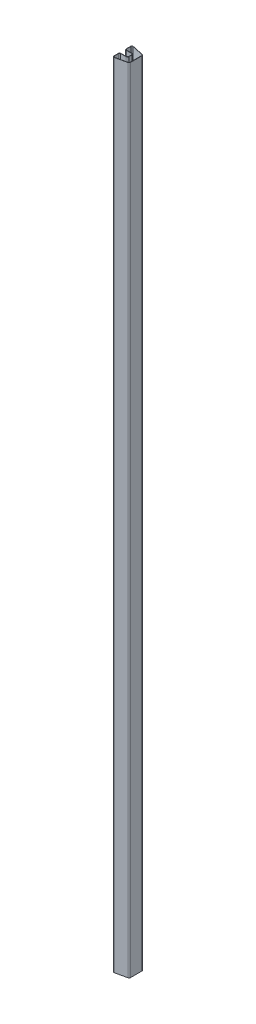
ISO-10303-21;
HEADER;
FILE_DESCRIPTION(('STEP AP214'),'2;1');
FILE_NAME('part.step','',(''),(''),'','','');
FILE_SCHEMA(('AUTOMOTIVE_DESIGN { 1 0 10303 214 1 1 1 1 }'));
ENDSEC;
DATA;
#1=APPLICATION_CONTEXT('core data for automotive mechanical design processes');
#2=APPLICATION_PROTOCOL_DEFINITION('international standard','automotive_design',2000,#1);
#3=PRODUCT_CONTEXT('',#1,'mechanical');
#4=PRODUCT('Part','Part','',(#3));
#5=PRODUCT_RELATED_PRODUCT_CATEGORY('part','',(#4));
#6=PRODUCT_DEFINITION_FORMATION('','',#4);
#7=PRODUCT_DEFINITION_CONTEXT('part definition',#1,'design');
#8=PRODUCT_DEFINITION('design','',#6,#7);
#9=PRODUCT_DEFINITION_SHAPE('','',#8);
#10=(LENGTH_UNIT() NAMED_UNIT(*) SI_UNIT(.MILLI.,.METRE.));
#11=(NAMED_UNIT(*) PLANE_ANGLE_UNIT() SI_UNIT($,.RADIAN.));
#12=(NAMED_UNIT(*) SI_UNIT($,.STERADIAN.) SOLID_ANGLE_UNIT());
#13=UNCERTAINTY_MEASURE_WITH_UNIT(LENGTH_MEASURE(1.E-05),#10,'distance_accuracy_value','');
#14=(GEOMETRIC_REPRESENTATION_CONTEXT(3) GLOBAL_UNCERTAINTY_ASSIGNED_CONTEXT((#13)) GLOBAL_UNIT_ASSIGNED_CONTEXT((#10,
#11,#12)) REPRESENTATION_CONTEXT('',''));
#15=CARTESIAN_POINT('',(0.,0.,0.));
#16=DIRECTION('',(0.,0.,1.));
#17=DIRECTION('',(1.,0.,0.));
#18=AXIS2_PLACEMENT_3D('',#15,#16,#17);
#19=CARTESIAN_POINT('',(0.,0.,0.));
#20=DIRECTION('',(0.,-1.,0.));
#21=DIRECTION('',(0.,0.,-1.));
#22=AXIS2_PLACEMENT_3D('',#19,#20,#21);
#23=PLANE('',#22);
#24=DIRECTION('',(0.976296007119934,0.,-0.216439613938102));
#25=VECTOR('',#24,1.);
#26=CARTESIAN_POINT('',(51.9976609563172,0.,46.0446230897532));
#27=LINE('',#26,#25);
#28=CARTESIAN_POINT('',(53.2141005702553,0.,45.7749449199157));
#29=VERTEX_POINT('',#28);
#30=CARTESIAN_POINT('',(61.7141005702553,0.,43.8905402874507));
#31=VERTEX_POINT('',#30);
#32=EDGE_CURVE('E348',#29,#31,#27,.T.);
#33=ORIENTED_EDGE('',*,*,#32,.F.);
#34=CARTESIAN_POINT('',(52.9976609563172,0.,44.7986489127958));
#35=DIRECTION('',(0.,-1.,0.));
#36=DIRECTION('',(0.,0.,-1.));
#37=AXIS2_PLACEMENT_3D('',#34,#35,#36);
#38=CIRCLE('',#37,1.);
#39=CARTESIAN_POINT('',(51.9976609563172,0.,44.7986489127958));
#40=VERTEX_POINT('',#39);
#41=EDGE_CURVE('E416',#29,#40,#38,.T.);
#42=ORIENTED_EDGE('',*,*,#41,.T.);
#43=DIRECTION('',(0.,0.,1.));
#44=VECTOR('',#43,1.);
#45=CARTESIAN_POINT('',(51.9976609563172,0.,40.5446230897532));
#46=LINE('',#45,#44);
#47=CARTESIAN_POINT('',(51.9976609563172,0.,41.5446230897532));
#48=VERTEX_POINT('',#47);
#49=EDGE_CURVE('E387',#48,#40,#46,.T.);
#50=ORIENTED_EDGE('',*,*,#49,.F.);
#51=CARTESIAN_POINT('',(52.9976609563172,0.,41.5446230897532));
#52=DIRECTION('',(0.,-1.,0.));
#53=DIRECTION('',(0.,0.,-1.));
#54=AXIS2_PLACEMENT_3D('',#51,#52,#53);
#55=CIRCLE('',#54,1.);
#56=CARTESIAN_POINT('',(52.9976609563172,0.,40.5446230897532));
#57=VERTEX_POINT('',#56);
#58=EDGE_CURVE('E414',#48,#57,#55,.T.);
#59=ORIENTED_EDGE('',*,*,#58,.T.);
#60=DIRECTION('',(-1.,0.,0.));
#61=VECTOR('',#60,1.);
#62=CARTESIAN_POINT('',(57.9976609563172,0.,40.5446230897533));
#63=LINE('',#62,#61);
#64=CARTESIAN_POINT('',(56.9976609563172,0.,40.5446230897533));
#65=VERTEX_POINT('',#64);
#66=EDGE_CURVE('E384',#65,#57,#63,.T.);
#67=ORIENTED_EDGE('',*,*,#66,.F.);
#68=CARTESIAN_POINT('',(56.9976609563172,0.,39.5446230897532));
#69=DIRECTION('',(0.,-1.,0.));
#70=DIRECTION('',(0.,0.,-1.));
#71=AXIS2_PLACEMENT_3D('',#68,#69,#70);
#72=CIRCLE('',#71,1.);
#73=CARTESIAN_POINT('',(57.9976609563172,0.,39.5446230897533));
#74=VERTEX_POINT('',#73);
#75=EDGE_CURVE('E455',#65,#74,#72,.F.);
#76=ORIENTED_EDGE('',*,*,#75,.T.);
#77=DIRECTION('',(0.,0.,1.));
#78=VECTOR('',#77,1.);
#79=CARTESIAN_POINT('',(57.9976609563172,0.,36.5446230897533));
#80=LINE('',#79,#78);
#81=CARTESIAN_POINT('',(57.9976609563172,0.,37.5446230897533));
#82=VERTEX_POINT('',#81);
#83=EDGE_CURVE('E381',#82,#74,#80,.T.);
#84=ORIENTED_EDGE('',*,*,#83,.F.);
#85=CARTESIAN_POINT('',(56.9976609563172,0.,37.5446230897533));
#86=DIRECTION('',(0.,-1.,0.));
#87=DIRECTION('',(0.,0.,-1.));
#88=AXIS2_PLACEMENT_3D('',#85,#86,#87);
#89=CIRCLE('',#88,1.);
#90=CARTESIAN_POINT('',(56.9976609563172,0.,36.5446230897533));
#91=VERTEX_POINT('',#90);
#92=EDGE_CURVE('E43',#82,#91,#89,.F.);
#93=ORIENTED_EDGE('',*,*,#92,.T.);
#94=DIRECTION('',(1.,0.,0.));
#95=VECTOR('',#94,1.);
#96=CARTESIAN_POINT('',(51.9976609563172,0.,36.5446230897533));
#97=LINE('',#96,#95);
#98=CARTESIAN_POINT('',(52.9976609563172,0.,36.5446230897533));
#99=VERTEX_POINT('',#98);
#100=EDGE_CURVE('E378',#99,#91,#97,.T.);
#101=ORIENTED_EDGE('',*,*,#100,.F.);
#102=CARTESIAN_POINT('',(52.9976609563172,0.,35.5446230897533));
#103=DIRECTION('',(0.,-1.,0.));
#104=DIRECTION('',(0.,0.,-1.));
#105=AXIS2_PLACEMENT_3D('',#102,#103,#104);
#106=CIRCLE('',#105,1.);
#107=CARTESIAN_POINT('',(51.9976609563172,0.,35.5446230897533));
#108=VERTEX_POINT('',#107);
#109=EDGE_CURVE('E412',#99,#108,#106,.T.);
#110=ORIENTED_EDGE('',*,*,#109,.T.);
#111=DIRECTION('',(0.,0.,1.));
#112=VECTOR('',#111,1.);
#113=CARTESIAN_POINT('',(51.9976609563173,0.,31.0446230897533));
#114=LINE('',#113,#112);
#115=CARTESIAN_POINT('',(51.9976609563173,0.,32.2905972667107));
#116=VERTEX_POINT('',#115);
#117=EDGE_CURVE('E375',#116,#108,#114,.T.);
#118=ORIENTED_EDGE('',*,*,#117,.F.);
#119=CARTESIAN_POINT('',(52.9976609563173,0.,32.2905972667107));
#120=DIRECTION('',(0.,-1.,0.));
#121=DIRECTION('',(0.,0.,-1.));
#122=AXIS2_PLACEMENT_3D('',#119,#120,#121);
#123=CIRCLE('',#122,1.);
#124=CARTESIAN_POINT('',(53.2141005702554,0.,31.3143012595908));
#125=VERTEX_POINT('',#124);
#126=EDGE_CURVE('E410',#116,#125,#123,.T.);
#127=ORIENTED_EDGE('',*,*,#126,.T.);
#128=DIRECTION('',(-0.976296007119932,0.,-0.216439613938108));
#129=VECTOR('',#128,1.);
#130=CARTESIAN_POINT('',(62.4976609563173,0.,33.3724170475042));
#131=LINE('',#130,#129);
#132=CARTESIAN_POINT('',(61.7141005702554,0.,33.1987058920558));
#133=VERTEX_POINT('',#132);
#134=EDGE_CURVE('E372',#133,#125,#131,.T.);
#135=ORIENTED_EDGE('',*,*,#134,.F.);
#136=CARTESIAN_POINT('',(61.4976609563173,0.,34.1750018991758));
#137=DIRECTION('',(0.,-1.,0.));
#138=DIRECTION('',(0.,0.,-1.));
#139=AXIS2_PLACEMENT_3D('',#136,#137,#138);
#140=CIRCLE('',#139,1.);
#141=CARTESIAN_POINT('',(62.4976609563173,0.,34.1750018991758));
#142=VERTEX_POINT('',#141);
#143=EDGE_CURVE('E408',#133,#142,#140,.T.);
#144=ORIENTED_EDGE('',*,*,#143,.T.);
#145=DIRECTION('',(0.,0.,-1.));
#146=VECTOR('',#145,1.);
#147=CARTESIAN_POINT('',(62.4976609563172,0.,43.7168291320024));
#148=LINE('',#147,#146);
#149=CARTESIAN_POINT('',(62.4976609563172,0.,42.9142442803308));
#150=VERTEX_POINT('',#149);
#151=EDGE_CURVE('E328',#150,#142,#148,.T.);
#152=ORIENTED_EDGE('',*,*,#151,.F.);
#153=CARTESIAN_POINT('',(61.4976609563172,0.,42.9142442803308));
#154=DIRECTION('',(0.,-1.,0.));
#155=DIRECTION('',(0.,0.,-1.));
#156=AXIS2_PLACEMENT_3D('',#153,#154,#155);
#157=CIRCLE('',#156,1.);
#158=EDGE_CURVE('E406',#150,#31,#157,.T.);
#159=ORIENTED_EDGE('',*,*,#158,.T.);
#160=EDGE_LOOP('',(#33,#42,#50,#59,#67,#76,#84,#93,#101,#110,#118,#127,#135,#144,#152,#159));
#161=FACE_BOUND('',#160,.T.);
#162=CARTESIAN_POINT('',(52.9976609563172,0.,44.7986489127958));
#163=DIRECTION('',(0.,-1.,0.));
#164=DIRECTION('',(0.,0.,-1.));
#165=AXIS2_PLACEMENT_3D('',#162,#163,#164);
#166=CIRCLE('',#165,0.8);
#167=CARTESIAN_POINT('',(53.1708126474677,0.,45.5796857184917));
#168=VERTEX_POINT('',#167);
#169=CARTESIAN_POINT('',(52.1976609563172,0.,44.7986489127958));
#170=VERTEX_POINT('',#169);
#171=EDGE_CURVE('E269',#168,#170,#166,.T.);
#172=ORIENTED_EDGE('',*,*,#171,.F.);
#173=DIRECTION('',(0.976296007119934,0.,-0.216439613938102));
#174=VECTOR('',#173,1.);
#175=CARTESIAN_POINT('',(12.1222493255186,0.,54.6799331161285));
#176=LINE('',#175,#174);
#177=CARTESIAN_POINT('',(61.6708126474677,0.,43.6952810860267));
#178=VERTEX_POINT('',#177);
#179=EDGE_CURVE('E261',#168,#178,#176,.T.);
#180=ORIENTED_EDGE('',*,*,#179,.T.);
#181=CARTESIAN_POINT('',(61.4976609563172,0.,42.9142442803308));
#182=DIRECTION('',(0.,-1.,0.));
#183=DIRECTION('',(0.,0.,-1.));
#184=AXIS2_PLACEMENT_3D('',#181,#182,#183);
#185=CIRCLE('',#184,0.8);
#186=CARTESIAN_POINT('',(62.2976609563172,0.,42.9142442803308));
#187=VERTEX_POINT('',#186);
#188=EDGE_CURVE('E246',#187,#178,#185,.T.);
#189=ORIENTED_EDGE('',*,*,#188,.F.);
#190=DIRECTION('',(0.,0.,-1.));
#191=VECTOR('',#190,1.);
#192=CARTESIAN_POINT('',(62.2976609563175,0.,3.76095974015518E-13));
#193=LINE('',#192,#191);
#194=CARTESIAN_POINT('',(62.2976609563173,0.,34.1750018991758));
#195=VERTEX_POINT('',#194);
#196=EDGE_CURVE('E58',#187,#195,#193,.T.);
#197=ORIENTED_EDGE('',*,*,#196,.T.);
#198=CARTESIAN_POINT('',(61.4976609563173,0.,34.1750018991758));
#199=DIRECTION('',(0.,-1.,0.));
#200=DIRECTION('',(0.,0.,-1.));
#201=AXIS2_PLACEMENT_3D('',#198,#199,#200);
#202=CIRCLE('',#201,0.8);
#203=CARTESIAN_POINT('',(61.6708126474677,2.22044604925031E-13,33.3939650934798));
#204=VERTEX_POINT('',#203);
#205=EDGE_CURVE('E254',#204,#195,#202,.T.);
#206=ORIENTED_EDGE('',*,*,#205,.F.);
#207=DIRECTION('',(-0.976296007119932,0.,-0.216439613938108));
#208=VECTOR('',#207,1.);
#209=CARTESIAN_POINT('',(-4.16741228412333,0.,18.7979820282604));
#210=LINE('',#209,#208);
#211=CARTESIAN_POINT('',(53.1708126474677,0.,31.5095604610148));
#212=VERTEX_POINT('',#211);
#213=EDGE_CURVE('E305',#204,#212,#210,.T.);
#214=ORIENTED_EDGE('',*,*,#213,.T.);
#215=CARTESIAN_POINT('',(52.9976609563173,0.,32.2905972667107));
#216=DIRECTION('',(0.,-1.,0.));
#217=DIRECTION('',(0.,0.,-1.));
#218=AXIS2_PLACEMENT_3D('',#215,#216,#217);
#219=CIRCLE('',#218,0.8);
#220=CARTESIAN_POINT('',(52.1976609563173,0.,32.2905972667107));
#221=VERTEX_POINT('',#220);
#222=EDGE_CURVE('E302',#221,#212,#219,.T.);
#223=ORIENTED_EDGE('',*,*,#222,.F.);
#224=DIRECTION('',(0.,0.,1.));
#225=VECTOR('',#224,1.);
#226=CARTESIAN_POINT('',(52.1976609563173,0.,0.));
#227=LINE('',#226,#225);
#228=CARTESIAN_POINT('',(52.1976609563173,0.,35.5446230897533));
#229=VERTEX_POINT('',#228);
#230=EDGE_CURVE('E300',#221,#229,#227,.T.);
#231=ORIENTED_EDGE('',*,*,#230,.T.);
#232=CARTESIAN_POINT('',(52.9976609563172,0.,35.5446230897533));
#233=DIRECTION('',(0.,-1.,0.));
#234=DIRECTION('',(0.,0.,-1.));
#235=AXIS2_PLACEMENT_3D('',#232,#233,#234);
#236=CIRCLE('',#235,0.8);
#237=CARTESIAN_POINT('',(52.9976609563172,0.,36.3446230897533));
#238=VERTEX_POINT('',#237);
#239=EDGE_CURVE('E284',#238,#229,#236,.T.);
#240=ORIENTED_EDGE('',*,*,#239,.F.);
#241=DIRECTION('',(1.,0.,0.));
#242=VECTOR('',#241,1.);
#243=CARTESIAN_POINT('',(0.,0.,36.3446230897533));
#244=LINE('',#243,#242);
#245=CARTESIAN_POINT('',(56.9976609563172,0.,36.3446230897533));
#246=VERTEX_POINT('',#245);
#247=EDGE_CURVE('E294',#238,#246,#244,.T.);
#248=ORIENTED_EDGE('',*,*,#247,.T.);
#249=CARTESIAN_POINT('',(56.9976609563172,0.,37.5446230897533));
#250=DIRECTION('',(0.,-1.,0.));
#251=DIRECTION('',(0.,0.,-1.));
#252=AXIS2_PLACEMENT_3D('',#249,#250,#251);
#253=CIRCLE('',#252,1.2);
#254=CARTESIAN_POINT('',(58.1976609563172,0.,37.5446230897533));
#255=VERTEX_POINT('',#254);
#256=EDGE_CURVE('E295',#255,#246,#253,.F.);
#257=ORIENTED_EDGE('',*,*,#256,.F.);
#258=DIRECTION('',(0.,0.,1.));
#259=VECTOR('',#258,1.);
#260=CARTESIAN_POINT('',(58.1976609563174,0.,3.02870546123588E-13));
#261=LINE('',#260,#259);
#262=CARTESIAN_POINT('',(58.1976609563172,0.,39.5446230897533));
#263=VERTEX_POINT('',#262);
#264=EDGE_CURVE('E287',#255,#263,#261,.T.);
#265=ORIENTED_EDGE('',*,*,#264,.T.);
#266=CARTESIAN_POINT('',(56.9976609563172,0.,39.5446230897532));
#267=DIRECTION('',(0.,-1.,0.));
#268=DIRECTION('',(0.,0.,-1.));
#269=AXIS2_PLACEMENT_3D('',#266,#267,#268);
#270=CIRCLE('',#269,1.2);
#271=CARTESIAN_POINT('',(56.9976609563172,0.,40.7446230897532));
#272=VERTEX_POINT('',#271);
#273=EDGE_CURVE('E288',#272,#263,#270,.F.);
#274=ORIENTED_EDGE('',*,*,#273,.F.);
#275=DIRECTION('',(-1.,0.,0.));
#276=VECTOR('',#275,1.);
#277=CARTESIAN_POINT('',(-2.35602180645404E-13,0.,40.7446230897529));
#278=LINE('',#277,#276);
#279=CARTESIAN_POINT('',(52.9976609563172,0.,40.7446230897532));
#280=VERTEX_POINT('',#279);
#281=EDGE_CURVE('E276',#272,#280,#278,.T.);
#282=ORIENTED_EDGE('',*,*,#281,.T.);
#283=CARTESIAN_POINT('',(52.9976609563172,0.,41.5446230897532));
#284=DIRECTION('',(0.,-1.,0.));
#285=DIRECTION('',(0.,0.,-1.));
#286=AXIS2_PLACEMENT_3D('',#283,#284,#285);
#287=CIRCLE('',#286,0.8);
#288=CARTESIAN_POINT('',(52.1976609563172,0.,41.5446230897532));
#289=VERTEX_POINT('',#288);
#290=EDGE_CURVE('E281',#289,#280,#287,.T.);
#291=ORIENTED_EDGE('',*,*,#290,.F.);
#292=DIRECTION('',(0.,0.,1.));
#293=VECTOR('',#292,1.);
#294=CARTESIAN_POINT('',(52.1976609563174,0.,1.97560380768004E-13));
#295=LINE('',#294,#293);
#296=EDGE_CURVE('E271',#289,#170,#295,.T.);
#297=ORIENTED_EDGE('',*,*,#296,.T.);
#298=EDGE_LOOP('',(#172,#180,#189,#197,#206,#214,#223,#231,#240,#248,#257,#265,#274,#282,#291,#297));
#299=FACE_BOUND('',#298,.T.);
#300=ADVANCED_FACE('F35',(#161,#299),#23,.T.);
#301=CARTESIAN_POINT('',(62.4976609563172,600.,43.7168291320024));
#302=DIRECTION('',(-1.,0.,0.));
#303=DIRECTION('',(0.,0.,1.));
#304=AXIS2_PLACEMENT_3D('',#301,#302,#303);
#305=PLANE('',#304);
#306=ORIENTED_EDGE('',*,*,#151,.T.);
#307=DIRECTION('',(0.,-1.,0.));
#308=VECTOR('',#307,1.);
#309=CARTESIAN_POINT('',(62.4976609563173,600.,34.1750018991758));
#310=LINE('',#309,#308);
#311=CARTESIAN_POINT('',(62.4976609563173,600.,34.1750018991758));
#312=VERTEX_POINT('',#311);
#313=EDGE_CURVE('E453',#142,#312,#310,.F.);
#314=ORIENTED_EDGE('',*,*,#313,.T.);
#315=DIRECTION('',(0.,0.,-1.));
#316=VECTOR('',#315,1.);
#317=CARTESIAN_POINT('',(62.4976609563172,600.,43.7168291320024));
#318=LINE('',#317,#316);
#319=CARTESIAN_POINT('',(62.4976609563172,600.,42.9142442803308));
#320=VERTEX_POINT('',#319);
#321=EDGE_CURVE('E344',#320,#312,#318,.T.);
#322=ORIENTED_EDGE('',*,*,#321,.F.);
#323=DIRECTION('',(0.,-1.,0.));
#324=VECTOR('',#323,1.);
#325=CARTESIAN_POINT('',(62.4976609563172,600.,42.9142442803308));
#326=LINE('',#325,#324);
#327=EDGE_CURVE('E450',#320,#150,#326,.T.);
#328=ORIENTED_EDGE('',*,*,#327,.T.);
#329=EDGE_LOOP('',(#306,#314,#322,#328));
#330=FACE_BOUND('',#329,.T.);
#331=ADVANCED_FACE('F509',(#330),#305,.F.);
#332=CARTESIAN_POINT('',(62.4976609563173,600.,33.3724170475042));
#333=DIRECTION('',(-0.216439613938108,0.,0.976296007119932));
#334=DIRECTION('',(0.976296007119932,0.,0.216439613938108));
#335=AXIS2_PLACEMENT_3D('',#332,#333,#334);
#336=PLANE('',#335);
#337=ORIENTED_EDGE('',*,*,#134,.T.);
#338=DIRECTION('',(0.,-1.,0.));
#339=VECTOR('',#338,1.);
#340=CARTESIAN_POINT('',(53.2141005702554,600.,31.3143012595908));
#341=LINE('',#340,#339);
#342=CARTESIAN_POINT('',(53.2141005702554,600.,31.3143012595908));
#343=VERTEX_POINT('',#342);
#344=EDGE_CURVE('E448',#125,#343,#341,.F.);
#345=ORIENTED_EDGE('',*,*,#344,.T.);
#346=DIRECTION('',(-0.976296007119932,0.,-0.216439613938108));
#347=VECTOR('',#346,1.);
#348=CARTESIAN_POINT('',(62.4976609563173,600.,33.3724170475042));
#349=LINE('',#348,#347);
#350=CARTESIAN_POINT('',(61.7141005702554,600.,33.1987058920558));
#351=VERTEX_POINT('',#350);
#352=EDGE_CURVE('E347',#351,#343,#349,.T.);
#353=ORIENTED_EDGE('',*,*,#352,.F.);
#354=DIRECTION('',(0.,-1.,0.));
#355=VECTOR('',#354,1.);
#356=CARTESIAN_POINT('',(61.7141005702554,600.,33.1987058920558));
#357=LINE('',#356,#355);
#358=EDGE_CURVE('E445',#351,#133,#357,.T.);
#359=ORIENTED_EDGE('',*,*,#358,.T.);
#360=EDGE_LOOP('',(#337,#345,#353,#359));
#361=FACE_BOUND('',#360,.T.);
#362=ADVANCED_FACE('F518',(#361),#336,.F.);
#363=CARTESIAN_POINT('',(51.9976609563173,600.,31.0446230897533));
#364=DIRECTION('',(1.,0.,0.));
#365=DIRECTION('',(0.,0.,-1.));
#366=AXIS2_PLACEMENT_3D('',#363,#364,#365);
#367=PLANE('',#366);
#368=ORIENTED_EDGE('',*,*,#117,.T.);
#369=DIRECTION('',(0.,-1.,0.));
#370=VECTOR('',#369,1.);
#371=CARTESIAN_POINT('',(51.9976609563172,600.,35.5446230897533));
#372=LINE('',#371,#370);
#373=CARTESIAN_POINT('',(51.9976609563172,600.,35.5446230897533));
#374=VERTEX_POINT('',#373);
#375=EDGE_CURVE('E443',#108,#374,#372,.F.);
#376=ORIENTED_EDGE('',*,*,#375,.T.);
#377=DIRECTION('',(0.,0.,1.));
#378=VECTOR('',#377,1.);
#379=CARTESIAN_POINT('',(51.9976609563173,600.,31.0446230897533));
#380=LINE('',#379,#378);
#381=CARTESIAN_POINT('',(51.9976609563173,600.,32.2905972667107));
#382=VERTEX_POINT('',#381);
#383=EDGE_CURVE('E351',#382,#374,#380,.T.);
#384=ORIENTED_EDGE('',*,*,#383,.F.);
#385=DIRECTION('',(0.,-1.,0.));
#386=VECTOR('',#385,1.);
#387=CARTESIAN_POINT('',(51.9976609563173,600.,32.2905972667107));
#388=LINE('',#387,#386);
#389=EDGE_CURVE('E440',#382,#116,#388,.T.);
#390=ORIENTED_EDGE('',*,*,#389,.T.);
#391=EDGE_LOOP('',(#368,#376,#384,#390));
#392=FACE_BOUND('',#391,.T.);
#393=ADVANCED_FACE('F527',(#392),#367,.F.);
#394=CARTESIAN_POINT('',(51.9976609563172,600.,36.5446230897533));
#395=DIRECTION('',(0.,0.,-1.));
#396=DIRECTION('',(-1.,0.,0.));
#397=AXIS2_PLACEMENT_3D('',#394,#395,#396);
#398=PLANE('',#397);
#399=ORIENTED_EDGE('',*,*,#100,.T.);
#400=DIRECTION('',(0.,-1.,0.));
#401=VECTOR('',#400,1.);
#402=CARTESIAN_POINT('',(56.9976609563172,600.,36.5446230897533));
#403=LINE('',#402,#401);
#404=CARTESIAN_POINT('',(56.9976609563172,600.,36.5446230897533));
#405=VERTEX_POINT('',#404);
#406=EDGE_CURVE('E438',#91,#405,#403,.F.);
#407=ORIENTED_EDGE('',*,*,#406,.T.);
#408=DIRECTION('',(1.,0.,0.));
#409=VECTOR('',#408,1.);
#410=CARTESIAN_POINT('',(51.9976609563172,600.,36.5446230897533));
#411=LINE('',#410,#409);
#412=CARTESIAN_POINT('',(52.9976609563172,600.,36.5446230897533));
#413=VERTEX_POINT('',#412);
#414=EDGE_CURVE('E354',#413,#405,#411,.T.);
#415=ORIENTED_EDGE('',*,*,#414,.F.);
#416=DIRECTION('',(0.,-1.,0.));
#417=VECTOR('',#416,1.);
#418=CARTESIAN_POINT('',(52.9976609563172,600.,36.5446230897533));
#419=LINE('',#418,#417);
#420=EDGE_CURVE('E435',#413,#99,#419,.T.);
#421=ORIENTED_EDGE('',*,*,#420,.T.);
#422=EDGE_LOOP('',(#399,#407,#415,#421));
#423=FACE_BOUND('',#422,.T.);
#424=ADVANCED_FACE('F466',(#423),#398,.F.);
#425=CARTESIAN_POINT('',(57.9976609563172,600.,36.5446230897533));
#426=DIRECTION('',(1.,0.,0.));
#427=DIRECTION('',(0.,0.,-1.));
#428=AXIS2_PLACEMENT_3D('',#425,#426,#427);
#429=PLANE('',#428);
#430=ORIENTED_EDGE('',*,*,#83,.T.);
#431=DIRECTION('',(0.,-1.,0.));
#432=VECTOR('',#431,1.);
#433=CARTESIAN_POINT('',(57.9976609563172,600.,39.5446230897533));
#434=LINE('',#433,#432);
#435=CARTESIAN_POINT('',(57.9976609563172,600.,39.5446230897533));
#436=VERTEX_POINT('',#435);
#437=EDGE_CURVE('E399',#74,#436,#434,.F.);
#438=ORIENTED_EDGE('',*,*,#437,.T.);
#439=DIRECTION('',(0.,0.,1.));
#440=VECTOR('',#439,1.);
#441=CARTESIAN_POINT('',(57.9976609563172,600.,36.5446230897533));
#442=LINE('',#441,#440);
#443=CARTESIAN_POINT('',(57.9976609563172,600.,37.5446230897533));
#444=VERTEX_POINT('',#443);
#445=EDGE_CURVE('E357',#444,#436,#442,.T.);
#446=ORIENTED_EDGE('',*,*,#445,.F.);
#447=DIRECTION('',(0.,-1.,0.));
#448=VECTOR('',#447,1.);
#449=CARTESIAN_POINT('',(57.9976609563172,0.,37.5446230897533));
#450=LINE('',#449,#448);
#451=EDGE_CURVE('E396',#444,#82,#450,.T.);
#452=ORIENTED_EDGE('',*,*,#451,.T.);
#453=EDGE_LOOP('',(#430,#438,#446,#452));
#454=FACE_BOUND('',#453,.T.);
#455=ADVANCED_FACE('F476',(#454),#429,.F.);
#456=CARTESIAN_POINT('',(57.9976609563172,600.,40.5446230897533));
#457=DIRECTION('',(0.,0.,1.));
#458=DIRECTION('',(1.,0.,0.));
#459=AXIS2_PLACEMENT_3D('',#456,#457,#458);
#460=PLANE('',#459);
#461=DIRECTION('',(-1.,0.,0.));
#462=VECTOR('',#461,1.);
#463=CARTESIAN_POINT('',(57.9976609563172,600.,40.5446230897533));
#464=LINE('',#463,#462);
#465=CARTESIAN_POINT('',(56.9976609563172,600.,40.5446230897533));
#466=VERTEX_POINT('',#465);
#467=CARTESIAN_POINT('',(52.9976609563172,600.,40.5446230897532));
#468=VERTEX_POINT('',#467);
#469=EDGE_CURVE('E360',#466,#468,#464,.T.);
#470=ORIENTED_EDGE('',*,*,#469,.F.);
#471=DIRECTION('',(0.,-1.,0.));
#472=VECTOR('',#471,1.);
#473=CARTESIAN_POINT('',(56.9976609563172,0.,40.5446230897533));
#474=LINE('',#473,#472);
#475=EDGE_CURVE('E393',#466,#65,#474,.T.);
#476=ORIENTED_EDGE('',*,*,#475,.T.);
#477=ORIENTED_EDGE('',*,*,#66,.T.);
#478=DIRECTION('',(0.,-1.,0.));
#479=VECTOR('',#478,1.);
#480=CARTESIAN_POINT('',(52.9976609563172,600.,40.5446230897532));
#481=LINE('',#480,#479);
#482=EDGE_CURVE('E369',#57,#468,#481,.F.);
#483=ORIENTED_EDGE('',*,*,#482,.T.);
#484=EDGE_LOOP('',(#470,#476,#477,#483));
#485=FACE_BOUND('',#484,.T.);
#486=ADVANCED_FACE('F484',(#485),#460,.F.);
#487=CARTESIAN_POINT('',(51.9976609563172,600.,40.5446230897532));
#488=DIRECTION('',(1.,0.,0.));
#489=DIRECTION('',(0.,0.,-1.));
#490=AXIS2_PLACEMENT_3D('',#487,#488,#489);
#491=PLANE('',#490);
#492=ORIENTED_EDGE('',*,*,#49,.T.);
#493=DIRECTION('',(0.,-1.,0.));
#494=VECTOR('',#493,1.);
#495=CARTESIAN_POINT('',(51.9976609563172,600.,44.7986489127958));
#496=LINE('',#495,#494);
#497=CARTESIAN_POINT('',(51.9976609563172,600.,44.7986489127958));
#498=VERTEX_POINT('',#497);
#499=EDGE_CURVE('E421',#40,#498,#496,.F.);
#500=ORIENTED_EDGE('',*,*,#499,.T.);
#501=DIRECTION('',(0.,0.,1.));
#502=VECTOR('',#501,1.);
#503=CARTESIAN_POINT('',(51.9976609563172,600.,40.5446230897532));
#504=LINE('',#503,#502);
#505=CARTESIAN_POINT('',(51.9976609563172,600.,41.5446230897532));
#506=VERTEX_POINT('',#505);
#507=EDGE_CURVE('E363',#506,#498,#504,.T.);
#508=ORIENTED_EDGE('',*,*,#507,.F.);
#509=DIRECTION('',(0.,-1.,0.));
#510=VECTOR('',#509,1.);
#511=CARTESIAN_POINT('',(51.9976609563172,600.,41.5446230897532));
#512=LINE('',#511,#510);
#513=EDGE_CURVE('E418',#506,#48,#512,.T.);
#514=ORIENTED_EDGE('',*,*,#513,.T.);
#515=EDGE_LOOP('',(#492,#500,#508,#514));
#516=FACE_BOUND('',#515,.T.);
#517=ADVANCED_FACE('F493',(#516),#491,.F.);
#518=CARTESIAN_POINT('',(51.9976609563172,600.,46.0446230897532));
#519=DIRECTION('',(-0.216439613938102,0.,-0.976296007119934));
#520=DIRECTION('',(-0.976296007119934,0.,0.216439613938102));
#521=AXIS2_PLACEMENT_3D('',#518,#519,#520);
#522=PLANE('',#521);
#523=DIRECTION('',(0.976296007119934,0.,-0.216439613938102));
#524=VECTOR('',#523,1.);
#525=CARTESIAN_POINT('',(51.9976609563172,600.,46.0446230897532));
#526=LINE('',#525,#524);
#527=CARTESIAN_POINT('',(53.2141005702553,600.,45.7749449199157));
#528=VERTEX_POINT('',#527);
#529=CARTESIAN_POINT('',(61.7141005702553,600.,43.8905402874507));
#530=VERTEX_POINT('',#529);
#531=EDGE_CURVE('E366',#528,#530,#526,.T.);
#532=ORIENTED_EDGE('',*,*,#531,.F.);
#533=DIRECTION('',(0.,-1.,0.));
#534=VECTOR('',#533,1.);
#535=CARTESIAN_POINT('',(53.2141005702553,600.,45.7749449199157));
#536=LINE('',#535,#534);
#537=EDGE_CURVE('E403',#528,#29,#536,.T.);
#538=ORIENTED_EDGE('',*,*,#537,.T.);
#539=ORIENTED_EDGE('',*,*,#32,.T.);
#540=DIRECTION('',(0.,-1.,0.));
#541=VECTOR('',#540,1.);
#542=CARTESIAN_POINT('',(61.7141005702553,600.,43.8905402874507));
#543=LINE('',#542,#541);
#544=EDGE_CURVE('E401',#31,#530,#543,.F.);
#545=ORIENTED_EDGE('',*,*,#544,.T.);
#546=EDGE_LOOP('',(#532,#538,#539,#545));
#547=FACE_BOUND('',#546,.T.);
#548=ADVANCED_FACE('F502',(#547),#522,.F.);
#549=CARTESIAN_POINT('',(0.,600.,0.));
#550=DIRECTION('',(0.,-1.,0.));
#551=DIRECTION('',(0.,0.,-1.));
#552=AXIS2_PLACEMENT_3D('',#549,#550,#551);
#553=PLANE('',#552);
#554=DIRECTION('',(0.,0.,1.));
#555=VECTOR('',#554,1.);
#556=CARTESIAN_POINT('',(52.1976609563174,600.,1.97560380768004E-13));
#557=LINE('',#556,#555);
#558=CARTESIAN_POINT('',(52.1976609563172,600.,41.5446230897532));
#559=VERTEX_POINT('',#558);
#560=CARTESIAN_POINT('',(52.1976609563172,600.,44.7986489127958));
#561=VERTEX_POINT('',#560);
#562=EDGE_CURVE('E333',#559,#561,#557,.T.);
#563=ORIENTED_EDGE('',*,*,#562,.F.);
#564=CARTESIAN_POINT('',(52.9976609563172,600.,41.5446230897532));
#565=DIRECTION('',(0.,-1.,0.));
#566=DIRECTION('',(0.,0.,-1.));
#567=AXIS2_PLACEMENT_3D('',#564,#565,#566);
#568=CIRCLE('',#567,0.8);
#569=CARTESIAN_POINT('',(52.9976609563172,600.,40.7446230897532));
#570=VERTEX_POINT('',#569);
#571=EDGE_CURVE('E323',#570,#559,#568,.F.);
#572=ORIENTED_EDGE('',*,*,#571,.F.);
#573=DIRECTION('',(-1.,0.,0.));
#574=VECTOR('',#573,1.);
#575=CARTESIAN_POINT('',(-2.35602180645404E-13,600.,40.7446230897529));
#576=LINE('',#575,#574);
#577=CARTESIAN_POINT('',(56.9976609563172,600.,40.7446230897532));
#578=VERTEX_POINT('',#577);
#579=EDGE_CURVE('E50',#578,#570,#576,.T.);
#580=ORIENTED_EDGE('',*,*,#579,.F.);
#581=CARTESIAN_POINT('',(56.9976609563172,600.,39.5446230897532));
#582=DIRECTION('',(0.,-1.,0.));
#583=DIRECTION('',(0.,0.,-1.));
#584=AXIS2_PLACEMENT_3D('',#581,#582,#583);
#585=CIRCLE('',#584,1.2);
#586=CARTESIAN_POINT('',(58.1976609563172,600.,39.5446230897533));
#587=VERTEX_POINT('',#586);
#588=EDGE_CURVE('E290',#587,#578,#585,.T.);
#589=ORIENTED_EDGE('',*,*,#588,.F.);
#590=DIRECTION('',(0.,0.,1.));
#591=VECTOR('',#590,1.);
#592=CARTESIAN_POINT('',(58.1976609563174,600.,3.02870546123588E-13));
#593=LINE('',#592,#591);
#594=CARTESIAN_POINT('',(58.1976609563172,600.,37.5446230897533));
#595=VERTEX_POINT('',#594);
#596=EDGE_CURVE('E326',#595,#587,#593,.T.);
#597=ORIENTED_EDGE('',*,*,#596,.F.);
#598=CARTESIAN_POINT('',(56.9976609563172,600.,37.5446230897533));
#599=DIRECTION('',(0.,-1.,0.));
#600=DIRECTION('',(0.,0.,-1.));
#601=AXIS2_PLACEMENT_3D('',#598,#599,#600);
#602=CIRCLE('',#601,1.2);
#603=CARTESIAN_POINT('',(56.9976609563172,600.,36.3446230897533));
#604=VERTEX_POINT('',#603);
#605=EDGE_CURVE('E297',#604,#595,#602,.T.);
#606=ORIENTED_EDGE('',*,*,#605,.F.);
#607=DIRECTION('',(1.,0.,0.));
#608=VECTOR('',#607,1.);
#609=CARTESIAN_POINT('',(0.,600.,36.3446230897533));
#610=LINE('',#609,#608);
#611=CARTESIAN_POINT('',(52.9976609563172,600.,36.3446230897533));
#612=VERTEX_POINT('',#611);
#613=EDGE_CURVE('E321',#612,#604,#610,.T.);
#614=ORIENTED_EDGE('',*,*,#613,.F.);
#615=CARTESIAN_POINT('',(52.9976609563172,600.,35.5446230897533));
#616=DIRECTION('',(0.,-1.,0.));
#617=DIRECTION('',(0.,0.,-1.));
#618=AXIS2_PLACEMENT_3D('',#615,#616,#617);
#619=CIRCLE('',#618,0.8);
#620=CARTESIAN_POINT('',(52.1976609563173,600.,35.5446230897533));
#621=VERTEX_POINT('',#620);
#622=EDGE_CURVE('E318',#621,#612,#619,.F.);
#623=ORIENTED_EDGE('',*,*,#622,.F.);
#624=DIRECTION('',(0.,0.,1.));
#625=VECTOR('',#624,1.);
#626=CARTESIAN_POINT('',(52.1976609563173,600.,0.));
#627=LINE('',#626,#625);
#628=CARTESIAN_POINT('',(52.1976609563173,600.,32.2905972667107));
#629=VERTEX_POINT('',#628);
#630=EDGE_CURVE('E316',#629,#621,#627,.T.);
#631=ORIENTED_EDGE('',*,*,#630,.F.);
#632=CARTESIAN_POINT('',(52.9976609563173,600.,32.2905972667107));
#633=DIRECTION('',(0.,-1.,0.));
#634=DIRECTION('',(0.,0.,-1.));
#635=AXIS2_PLACEMENT_3D('',#632,#633,#634);
#636=CIRCLE('',#635,0.8);
#637=CARTESIAN_POINT('',(53.1708126474677,600.,31.5095604610148));
#638=VERTEX_POINT('',#637);
#639=EDGE_CURVE('E312',#638,#629,#636,.F.);
#640=ORIENTED_EDGE('',*,*,#639,.F.);
#641=DIRECTION('',(-0.976296007119932,0.,-0.216439613938108));
#642=VECTOR('',#641,1.);
#643=CARTESIAN_POINT('',(-4.16741228412333,600.,18.7979820282604));
#644=LINE('',#643,#642);
#645=CARTESIAN_POINT('',(61.6708126474677,600.,33.3939650934798));
#646=VERTEX_POINT('',#645);
#647=EDGE_CURVE('E274',#646,#638,#644,.T.);
#648=ORIENTED_EDGE('',*,*,#647,.F.);
#649=CARTESIAN_POINT('',(61.4976609563173,600.,34.1750018991758));
#650=DIRECTION('',(0.,-1.,0.));
#651=DIRECTION('',(0.,0.,-1.));
#652=AXIS2_PLACEMENT_3D('',#649,#650,#651);
#653=CIRCLE('',#652,0.8);
#654=CARTESIAN_POINT('',(62.2976609563173,600.,34.1750018991758));
#655=VERTEX_POINT('',#654);
#656=EDGE_CURVE('E310',#655,#646,#653,.F.);
#657=ORIENTED_EDGE('',*,*,#656,.F.);
#658=DIRECTION('',(0.,0.,-1.));
#659=VECTOR('',#658,1.);
#660=CARTESIAN_POINT('',(62.2976609563175,600.,3.76095974015518E-13));
#661=LINE('',#660,#659);
#662=CARTESIAN_POINT('',(62.2976609563172,600.,42.9142442803308));
#663=VERTEX_POINT('',#662);
#664=EDGE_CURVE('E270',#663,#655,#661,.T.);
#665=ORIENTED_EDGE('',*,*,#664,.F.);
#666=CARTESIAN_POINT('',(61.4976609563172,600.,42.9142442803308));
#667=DIRECTION('',(0.,-1.,0.));
#668=DIRECTION('',(0.,0.,-1.));
#669=AXIS2_PLACEMENT_3D('',#666,#667,#668);
#670=CIRCLE('',#669,0.8);
#671=CARTESIAN_POINT('',(61.6708126474677,600.,43.6952810860267));
#672=VERTEX_POINT('',#671);
#673=EDGE_CURVE('E313',#672,#663,#670,.F.);
#674=ORIENTED_EDGE('',*,*,#673,.F.);
#675=DIRECTION('',(0.976296007119934,0.,-0.216439613938102));
#676=VECTOR('',#675,1.);
#677=CARTESIAN_POINT('',(12.1222493255186,600.,54.6799331161285));
#678=LINE('',#677,#676);
#679=CARTESIAN_POINT('',(53.1708126474677,600.,45.5796857184917));
#680=VERTEX_POINT('',#679);
#681=EDGE_CURVE('E264',#680,#672,#678,.T.);
#682=ORIENTED_EDGE('',*,*,#681,.F.);
#683=CARTESIAN_POINT('',(52.9976609563172,600.,44.7986489127958));
#684=DIRECTION('',(0.,-1.,0.));
#685=DIRECTION('',(0.,0.,-1.));
#686=AXIS2_PLACEMENT_3D('',#683,#684,#685);
#687=CIRCLE('',#686,0.8);
#688=EDGE_CURVE('E335',#561,#680,#687,.F.);
#689=ORIENTED_EDGE('',*,*,#688,.F.);
#690=EDGE_LOOP('',(#563,#572,#580,#589,#597,#606,#614,#623,#631,#640,#648,#657,#665,#674,#682,#689));
#691=FACE_BOUND('',#690,.T.);
#692=ORIENTED_EDGE('',*,*,#507,.T.);
#693=CARTESIAN_POINT('',(52.9976609563172,600.,44.7986489127958));
#694=DIRECTION('',(0.,-1.,0.));
#695=DIRECTION('',(0.,0.,-1.));
#696=AXIS2_PLACEMENT_3D('',#693,#694,#695);
#697=CIRCLE('',#696,1.);
#698=EDGE_CURVE('E433',#498,#528,#697,.F.);
#699=ORIENTED_EDGE('',*,*,#698,.T.);
#700=ORIENTED_EDGE('',*,*,#531,.T.);
#701=CARTESIAN_POINT('',(61.4976609563172,600.,42.9142442803308));
#702=DIRECTION('',(0.,-1.,0.));
#703=DIRECTION('',(0.,0.,-1.));
#704=AXIS2_PLACEMENT_3D('',#701,#702,#703);
#705=CIRCLE('',#704,1.);
#706=EDGE_CURVE('E423',#530,#320,#705,.F.);
#707=ORIENTED_EDGE('',*,*,#706,.T.);
#708=ORIENTED_EDGE('',*,*,#321,.T.);
#709=CARTESIAN_POINT('',(61.4976609563173,600.,34.1750018991758));
#710=DIRECTION('',(0.,-1.,0.));
#711=DIRECTION('',(0.,0.,-1.));
#712=AXIS2_PLACEMENT_3D('',#709,#710,#711);
#713=CIRCLE('',#712,1.);
#714=EDGE_CURVE('E425',#312,#351,#713,.F.);
#715=ORIENTED_EDGE('',*,*,#714,.T.);
#716=ORIENTED_EDGE('',*,*,#352,.T.);
#717=CARTESIAN_POINT('',(52.9976609563173,600.,32.2905972667107));
#718=DIRECTION('',(0.,-1.,0.));
#719=DIRECTION('',(0.,0.,-1.));
#720=AXIS2_PLACEMENT_3D('',#717,#718,#719);
#721=CIRCLE('',#720,1.);
#722=EDGE_CURVE('E427',#343,#382,#721,.F.);
#723=ORIENTED_EDGE('',*,*,#722,.T.);
#724=ORIENTED_EDGE('',*,*,#383,.T.);
#725=CARTESIAN_POINT('',(52.9976609563172,600.,35.5446230897533));
#726=DIRECTION('',(0.,-1.,0.));
#727=DIRECTION('',(0.,0.,-1.));
#728=AXIS2_PLACEMENT_3D('',#725,#726,#727);
#729=CIRCLE('',#728,1.);
#730=EDGE_CURVE('E429',#374,#413,#729,.F.);
#731=ORIENTED_EDGE('',*,*,#730,.T.);
#732=ORIENTED_EDGE('',*,*,#414,.T.);
#733=CARTESIAN_POINT('',(56.9976609563172,600.,37.5446230897533));
#734=DIRECTION('',(0.,-1.,0.));
#735=DIRECTION('',(0.,0.,-1.));
#736=AXIS2_PLACEMENT_3D('',#733,#734,#735);
#737=CIRCLE('',#736,1.);
#738=EDGE_CURVE('E11',#405,#444,#737,.T.);
#739=ORIENTED_EDGE('',*,*,#738,.T.);
#740=ORIENTED_EDGE('',*,*,#445,.T.);
#741=CARTESIAN_POINT('',(56.9976609563172,600.,39.5446230897532));
#742=DIRECTION('',(0.,-1.,0.));
#743=DIRECTION('',(0.,0.,-1.));
#744=AXIS2_PLACEMENT_3D('',#741,#742,#743);
#745=CIRCLE('',#744,1.);
#746=EDGE_CURVE('E457',#436,#466,#745,.T.);
#747=ORIENTED_EDGE('',*,*,#746,.T.);
#748=ORIENTED_EDGE('',*,*,#469,.T.);
#749=CARTESIAN_POINT('',(52.9976609563172,600.,41.5446230897532));
#750=DIRECTION('',(0.,-1.,0.));
#751=DIRECTION('',(0.,0.,-1.));
#752=AXIS2_PLACEMENT_3D('',#749,#750,#751);
#753=CIRCLE('',#752,1.);
#754=EDGE_CURVE('E431',#468,#506,#753,.F.);
#755=ORIENTED_EDGE('',*,*,#754,.T.);
#756=EDGE_LOOP('',(#692,#699,#700,#707,#708,#715,#716,#723,#724,#731,#732,#739,#740,#747,#748,#755));
#757=FACE_BOUND('',#756,.T.);
#758=ADVANCED_FACE('F473',(#691,#757),#553,.F.);
#759=CARTESIAN_POINT('',(56.9976609563172,600.,39.5446230897532));
#760=DIRECTION('',(0.,1.,0.));
#761=DIRECTION('',(0.,0.,1.));
#762=AXIS2_PLACEMENT_3D('',#759,#760,#761);
#763=CYLINDRICAL_SURFACE('',#762,1.);
#764=ORIENTED_EDGE('',*,*,#746,.F.);
#765=ORIENTED_EDGE('',*,*,#437,.F.);
#766=ORIENTED_EDGE('',*,*,#75,.F.);
#767=ORIENTED_EDGE('',*,*,#475,.F.);
#768=EDGE_LOOP('',(#764,#765,#766,#767));
#769=FACE_BOUND('',#768,.T.);
#770=ADVANCED_FACE('F479',(#769),#763,.F.);
#771=CARTESIAN_POINT('',(52.9976609563172,600.,44.7986489127958));
#772=DIRECTION('',(0.,-1.,0.));
#773=DIRECTION('',(0.,0.,-1.));
#774=AXIS2_PLACEMENT_3D('',#771,#772,#773);
#775=CYLINDRICAL_SURFACE('',#774,1.);
#776=ORIENTED_EDGE('',*,*,#698,.F.);
#777=ORIENTED_EDGE('',*,*,#499,.F.);
#778=ORIENTED_EDGE('',*,*,#41,.F.);
#779=ORIENTED_EDGE('',*,*,#537,.F.);
#780=EDGE_LOOP('',(#776,#777,#778,#779));
#781=FACE_BOUND('',#780,.T.);
#782=ADVANCED_FACE('F497',(#781),#775,.T.);
#783=CARTESIAN_POINT('',(52.9976609563172,600.,41.5446230897532));
#784=DIRECTION('',(0.,-1.,0.));
#785=DIRECTION('',(0.,0.,-1.));
#786=AXIS2_PLACEMENT_3D('',#783,#784,#785);
#787=CYLINDRICAL_SURFACE('',#786,1.);
#788=ORIENTED_EDGE('',*,*,#754,.F.);
#789=ORIENTED_EDGE('',*,*,#482,.F.);
#790=ORIENTED_EDGE('',*,*,#58,.F.);
#791=ORIENTED_EDGE('',*,*,#513,.F.);
#792=EDGE_LOOP('',(#788,#789,#790,#791));
#793=FACE_BOUND('',#792,.T.);
#794=ADVANCED_FACE('F488',(#793),#787,.T.);
#795=CARTESIAN_POINT('',(56.9976609563172,600.,37.5446230897533));
#796=DIRECTION('',(0.,1.,0.));
#797=DIRECTION('',(0.,0.,1.));
#798=AXIS2_PLACEMENT_3D('',#795,#796,#797);
#799=CYLINDRICAL_SURFACE('',#798,1.);
#800=ORIENTED_EDGE('',*,*,#738,.F.);
#801=ORIENTED_EDGE('',*,*,#406,.F.);
#802=ORIENTED_EDGE('',*,*,#92,.F.);
#803=ORIENTED_EDGE('',*,*,#451,.F.);
#804=EDGE_LOOP('',(#800,#801,#802,#803));
#805=FACE_BOUND('',#804,.T.);
#806=ADVANCED_FACE('F470',(#805),#799,.F.);
#807=CARTESIAN_POINT('',(52.9976609563172,600.,35.5446230897533));
#808=DIRECTION('',(0.,-1.,0.));
#809=DIRECTION('',(0.,0.,-1.));
#810=AXIS2_PLACEMENT_3D('',#807,#808,#809);
#811=CYLINDRICAL_SURFACE('',#810,1.);
#812=ORIENTED_EDGE('',*,*,#730,.F.);
#813=ORIENTED_EDGE('',*,*,#375,.F.);
#814=ORIENTED_EDGE('',*,*,#109,.F.);
#815=ORIENTED_EDGE('',*,*,#420,.F.);
#816=EDGE_LOOP('',(#812,#813,#814,#815));
#817=FACE_BOUND('',#816,.T.);
#818=ADVANCED_FACE('F531',(#817),#811,.T.);
#819=CARTESIAN_POINT('',(52.9976609563173,600.,32.2905972667107));
#820=DIRECTION('',(0.,-1.,0.));
#821=DIRECTION('',(0.,0.,-1.));
#822=AXIS2_PLACEMENT_3D('',#819,#820,#821);
#823=CYLINDRICAL_SURFACE('',#822,1.);
#824=ORIENTED_EDGE('',*,*,#722,.F.);
#825=ORIENTED_EDGE('',*,*,#344,.F.);
#826=ORIENTED_EDGE('',*,*,#126,.F.);
#827=ORIENTED_EDGE('',*,*,#389,.F.);
#828=EDGE_LOOP('',(#824,#825,#826,#827));
#829=FACE_BOUND('',#828,.T.);
#830=ADVANCED_FACE('F522',(#829),#823,.T.);
#831=CARTESIAN_POINT('',(61.4976609563173,600.,34.1750018991758));
#832=DIRECTION('',(0.,-1.,0.));
#833=DIRECTION('',(0.,0.,-1.));
#834=AXIS2_PLACEMENT_3D('',#831,#832,#833);
#835=CYLINDRICAL_SURFACE('',#834,1.);
#836=ORIENTED_EDGE('',*,*,#714,.F.);
#837=ORIENTED_EDGE('',*,*,#313,.F.);
#838=ORIENTED_EDGE('',*,*,#143,.F.);
#839=ORIENTED_EDGE('',*,*,#358,.F.);
#840=EDGE_LOOP('',(#836,#837,#838,#839));
#841=FACE_BOUND('',#840,.T.);
#842=ADVANCED_FACE('F513',(#841),#835,.T.);
#843=CARTESIAN_POINT('',(61.4976609563172,600.,42.9142442803308));
#844=DIRECTION('',(0.,-1.,0.));
#845=DIRECTION('',(0.,0.,-1.));
#846=AXIS2_PLACEMENT_3D('',#843,#844,#845);
#847=CYLINDRICAL_SURFACE('',#846,1.);
#848=ORIENTED_EDGE('',*,*,#706,.F.);
#849=ORIENTED_EDGE('',*,*,#544,.F.);
#850=ORIENTED_EDGE('',*,*,#158,.F.);
#851=ORIENTED_EDGE('',*,*,#327,.F.);
#852=EDGE_LOOP('',(#848,#849,#850,#851));
#853=FACE_BOUND('',#852,.T.);
#854=ADVANCED_FACE('F37',(#853),#847,.T.);
#855=CARTESIAN_POINT('',(62.2976609563172,600.,43.7168291320024));
#856=DIRECTION('',(-1.,0.,0.));
#857=DIRECTION('',(0.,0.,1.));
#858=AXIS2_PLACEMENT_3D('',#855,#856,#857);
#859=PLANE('',#858);
#860=ORIENTED_EDGE('',*,*,#196,.F.);
#861=DIRECTION('',(0.,1.,0.));
#862=VECTOR('',#861,1.);
#863=CARTESIAN_POINT('',(62.2976609563172,600.,42.9142442803308));
#864=LINE('',#863,#862);
#865=EDGE_CURVE('E251',#663,#187,#864,.F.);
#866=ORIENTED_EDGE('',*,*,#865,.F.);
#867=ORIENTED_EDGE('',*,*,#664,.T.);
#868=DIRECTION('',(0.,1.,0.));
#869=VECTOR('',#868,1.);
#870=CARTESIAN_POINT('',(62.2976609563173,600.,34.1750018991758));
#871=LINE('',#870,#869);
#872=EDGE_CURVE('E291',#195,#655,#871,.T.);
#873=ORIENTED_EDGE('',*,*,#872,.F.);
#874=EDGE_LOOP('',(#860,#866,#867,#873));
#875=FACE_BOUND('',#874,.T.);
#876=ADVANCED_FACE('F601',(#875),#859,.T.);
#877=CARTESIAN_POINT('',(62.4543730335296,600.,33.5676762489282));
#878=DIRECTION('',(-0.216439613938108,0.,0.976296007119932));
#879=DIRECTION('',(0.976296007119932,0.,0.216439613938108));
#880=AXIS2_PLACEMENT_3D('',#877,#878,#879);
#881=PLANE('',#880);
#882=ORIENTED_EDGE('',*,*,#213,.F.);
#883=DIRECTION('',(0.,1.,0.));
#884=VECTOR('',#883,1.);
#885=CARTESIAN_POINT('',(61.6708126474677,600.,33.3939650934798));
#886=LINE('',#885,#884);
#887=EDGE_CURVE('E773',#646,#204,#886,.F.);
#888=ORIENTED_EDGE('',*,*,#887,.F.);
#889=ORIENTED_EDGE('',*,*,#647,.T.);
#890=DIRECTION('',(0.,1.,0.));
#891=VECTOR('',#890,1.);
#892=CARTESIAN_POINT('',(53.1708126474677,600.,31.5095604610148));
#893=LINE('',#892,#891);
#894=EDGE_CURVE('E780',#212,#638,#893,.T.);
#895=ORIENTED_EDGE('',*,*,#894,.F.);
#896=EDGE_LOOP('',(#882,#888,#889,#895));
#897=FACE_BOUND('',#896,.T.);
#898=ADVANCED_FACE('F624',(#897),#881,.T.);
#899=CARTESIAN_POINT('',(52.1976609563173,600.,31.0446230897533));
#900=DIRECTION('',(1.,0.,0.));
#901=DIRECTION('',(0.,0.,-1.));
#902=AXIS2_PLACEMENT_3D('',#899,#900,#901);
#903=PLANE('',#902);
#904=ORIENTED_EDGE('',*,*,#230,.F.);
#905=DIRECTION('',(0.,1.,0.));
#906=VECTOR('',#905,1.);
#907=CARTESIAN_POINT('',(52.1976609563173,600.,32.2905972667107));
#908=LINE('',#907,#906);
#909=EDGE_CURVE('E787',#629,#221,#908,.F.);
#910=ORIENTED_EDGE('',*,*,#909,.F.);
#911=ORIENTED_EDGE('',*,*,#630,.T.);
#912=DIRECTION('',(0.,1.,0.));
#913=VECTOR('',#912,1.);
#914=CARTESIAN_POINT('',(52.1976609563173,600.,35.5446230897533));
#915=LINE('',#914,#913);
#916=EDGE_CURVE('E781',#229,#621,#915,.T.);
#917=ORIENTED_EDGE('',*,*,#916,.F.);
#918=EDGE_LOOP('',(#904,#910,#911,#917));
#919=FACE_BOUND('',#918,.T.);
#920=ADVANCED_FACE('F633',(#919),#903,.T.);
#921=CARTESIAN_POINT('',(51.9976609563172,600.,36.3446230897533));
#922=DIRECTION('',(0.,0.,-1.));
#923=DIRECTION('',(-1.,0.,0.));
#924=AXIS2_PLACEMENT_3D('',#921,#922,#923);
#925=PLANE('',#924);
#926=ORIENTED_EDGE('',*,*,#247,.F.);
#927=DIRECTION('',(0.,1.,0.));
#928=VECTOR('',#927,1.);
#929=CARTESIAN_POINT('',(52.9976609563172,600.,36.3446230897533));
#930=LINE('',#929,#928);
#931=EDGE_CURVE('E339',#612,#238,#930,.F.);
#932=ORIENTED_EDGE('',*,*,#931,.F.);
#933=ORIENTED_EDGE('',*,*,#613,.T.);
#934=DIRECTION('',(0.,1.,0.));
#935=VECTOR('',#934,1.);
#936=CARTESIAN_POINT('',(56.9976609563172,600.,36.3446230897533));
#937=LINE('',#936,#935);
#938=EDGE_CURVE('E791',#246,#604,#937,.T.);
#939=ORIENTED_EDGE('',*,*,#938,.F.);
#940=EDGE_LOOP('',(#926,#932,#933,#939));
#941=FACE_BOUND('',#940,.T.);
#942=ADVANCED_FACE('F643',(#941),#925,.T.);
#943=CARTESIAN_POINT('',(58.1976609563172,600.,36.5446230897533));
#944=DIRECTION('',(1.,0.,0.));
#945=DIRECTION('',(0.,0.,-1.));
#946=AXIS2_PLACEMENT_3D('',#943,#944,#945);
#947=PLANE('',#946);
#948=ORIENTED_EDGE('',*,*,#264,.F.);
#949=DIRECTION('',(0.,1.,0.));
#950=VECTOR('',#949,1.);
#951=CARTESIAN_POINT('',(58.1976609563172,600.,37.5446230897533));
#952=LINE('',#951,#950);
#953=EDGE_CURVE('E798',#595,#255,#952,.F.);
#954=ORIENTED_EDGE('',*,*,#953,.F.);
#955=ORIENTED_EDGE('',*,*,#596,.T.);
#956=DIRECTION('',(0.,1.,0.));
#957=VECTOR('',#956,1.);
#958=CARTESIAN_POINT('',(58.1976609563172,600.,39.5446230897533));
#959=LINE('',#958,#957);
#960=EDGE_CURVE('E266',#263,#587,#959,.T.);
#961=ORIENTED_EDGE('',*,*,#960,.F.);
#962=EDGE_LOOP('',(#948,#954,#955,#961));
#963=FACE_BOUND('',#962,.T.);
#964=ADVANCED_FACE('F653',(#963),#947,.T.);
#965=CARTESIAN_POINT('',(57.9976609563172,600.,40.7446230897533));
#966=DIRECTION('',(0.,0.,1.));
#967=DIRECTION('',(1.,0.,0.));
#968=AXIS2_PLACEMENT_3D('',#965,#966,#967);
#969=PLANE('',#968);
#970=ORIENTED_EDGE('',*,*,#579,.T.);
#971=DIRECTION('',(0.,1.,0.));
#972=VECTOR('',#971,1.);
#973=CARTESIAN_POINT('',(52.9976609563172,600.,40.7446230897532));
#974=LINE('',#973,#972);
#975=EDGE_CURVE('E341',#280,#570,#974,.T.);
#976=ORIENTED_EDGE('',*,*,#975,.F.);
#977=ORIENTED_EDGE('',*,*,#281,.F.);
#978=DIRECTION('',(0.,1.,0.));
#979=VECTOR('',#978,1.);
#980=CARTESIAN_POINT('',(56.9976609563172,600.,40.7446230897532));
#981=LINE('',#980,#979);
#982=EDGE_CURVE('E800',#578,#272,#981,.F.);
#983=ORIENTED_EDGE('',*,*,#982,.F.);
#984=EDGE_LOOP('',(#970,#976,#977,#983));
#985=FACE_BOUND('',#984,.T.);
#986=ADVANCED_FACE('F663',(#985),#969,.T.);
#987=CARTESIAN_POINT('',(52.1976609563172,600.,40.5446230897532));
#988=DIRECTION('',(1.,0.,0.));
#989=DIRECTION('',(0.,0.,-1.));
#990=AXIS2_PLACEMENT_3D('',#987,#988,#989);
#991=PLANE('',#990);
#992=ORIENTED_EDGE('',*,*,#296,.F.);
#993=DIRECTION('',(0.,1.,0.));
#994=VECTOR('',#993,1.);
#995=CARTESIAN_POINT('',(52.1976609563172,600.,41.5446230897532));
#996=LINE('',#995,#994);
#997=EDGE_CURVE('E280',#559,#289,#996,.F.);
#998=ORIENTED_EDGE('',*,*,#997,.F.);
#999=ORIENTED_EDGE('',*,*,#562,.T.);
#1000=DIRECTION('',(0.,1.,0.));
#1001=VECTOR('',#1000,1.);
#1002=CARTESIAN_POINT('',(52.1976609563172,600.,44.7986489127958));
#1003=LINE('',#1002,#1001);
#1004=EDGE_CURVE('E343',#170,#561,#1003,.T.);
#1005=ORIENTED_EDGE('',*,*,#1004,.F.);
#1006=EDGE_LOOP('',(#992,#998,#999,#1005));
#1007=FACE_BOUND('',#1006,.T.);
#1008=ADVANCED_FACE('F673',(#1007),#991,.T.);
#1009=CARTESIAN_POINT('',(51.9543730335296,600.,45.8493638883292));
#1010=DIRECTION('',(-0.216439613938102,0.,-0.976296007119934));
#1011=DIRECTION('',(-0.976296007119934,0.,0.216439613938102));
#1012=AXIS2_PLACEMENT_3D('',#1009,#1010,#1011);
#1013=PLANE('',#1012);
#1014=ORIENTED_EDGE('',*,*,#681,.T.);
#1015=DIRECTION('',(0.,1.,0.));
#1016=VECTOR('',#1015,1.);
#1017=CARTESIAN_POINT('',(61.6708126474677,600.,43.6952810860267));
#1018=LINE('',#1017,#1016);
#1019=EDGE_CURVE('E249',#178,#672,#1018,.T.);
#1020=ORIENTED_EDGE('',*,*,#1019,.F.);
#1021=ORIENTED_EDGE('',*,*,#179,.F.);
#1022=DIRECTION('',(0.,1.,0.));
#1023=VECTOR('',#1022,1.);
#1024=CARTESIAN_POINT('',(53.1708126474677,600.,45.5796857184917));
#1025=LINE('',#1024,#1023);
#1026=EDGE_CURVE('E255',#680,#168,#1025,.F.);
#1027=ORIENTED_EDGE('',*,*,#1026,.F.);
#1028=EDGE_LOOP('',(#1014,#1020,#1021,#1027));
#1029=FACE_BOUND('',#1028,.T.);
#1030=ADVANCED_FACE('F259',(#1029),#1013,.T.);
#1031=CARTESIAN_POINT('',(56.9976609563172,600.,39.5446230897532));
#1032=DIRECTION('',(0.,1.,0.));
#1033=DIRECTION('',(0.,0.,1.));
#1034=AXIS2_PLACEMENT_3D('',#1031,#1032,#1033);
#1035=CYLINDRICAL_SURFACE('',#1034,1.2);
#1036=ORIENTED_EDGE('',*,*,#588,.T.);
#1037=ORIENTED_EDGE('',*,*,#982,.T.);
#1038=ORIENTED_EDGE('',*,*,#273,.T.);
#1039=ORIENTED_EDGE('',*,*,#960,.T.);
#1040=EDGE_LOOP('',(#1036,#1037,#1038,#1039));
#1041=FACE_BOUND('',#1040,.T.);
#1042=ADVANCED_FACE('F691',(#1041),#1035,.T.);
#1043=CARTESIAN_POINT('',(52.9976609563172,600.,44.7986489127958));
#1044=DIRECTION('',(0.,-1.,0.));
#1045=DIRECTION('',(0.,0.,-1.));
#1046=AXIS2_PLACEMENT_3D('',#1043,#1044,#1045);
#1047=CYLINDRICAL_SURFACE('',#1046,0.8);
#1048=ORIENTED_EDGE('',*,*,#688,.T.);
#1049=ORIENTED_EDGE('',*,*,#1026,.T.);
#1050=ORIENTED_EDGE('',*,*,#171,.T.);
#1051=ORIENTED_EDGE('',*,*,#1004,.T.);
#1052=EDGE_LOOP('',(#1048,#1049,#1050,#1051));
#1053=FACE_BOUND('',#1052,.T.);
#1054=ADVANCED_FACE('F700',(#1053),#1047,.F.);
#1055=CARTESIAN_POINT('',(52.9976609563172,600.,41.5446230897532));
#1056=DIRECTION('',(0.,-1.,0.));
#1057=DIRECTION('',(0.,0.,-1.));
#1058=AXIS2_PLACEMENT_3D('',#1055,#1056,#1057);
#1059=CYLINDRICAL_SURFACE('',#1058,0.8);
#1060=ORIENTED_EDGE('',*,*,#571,.T.);
#1061=ORIENTED_EDGE('',*,*,#997,.T.);
#1062=ORIENTED_EDGE('',*,*,#290,.T.);
#1063=ORIENTED_EDGE('',*,*,#975,.T.);
#1064=EDGE_LOOP('',(#1060,#1061,#1062,#1063));
#1065=FACE_BOUND('',#1064,.T.);
#1066=ADVANCED_FACE('F710',(#1065),#1059,.F.);
#1067=CARTESIAN_POINT('',(56.9976609563172,600.,37.5446230897533));
#1068=DIRECTION('',(0.,1.,0.));
#1069=DIRECTION('',(0.,0.,1.));
#1070=AXIS2_PLACEMENT_3D('',#1067,#1068,#1069);
#1071=CYLINDRICAL_SURFACE('',#1070,1.2);
#1072=ORIENTED_EDGE('',*,*,#605,.T.);
#1073=ORIENTED_EDGE('',*,*,#953,.T.);
#1074=ORIENTED_EDGE('',*,*,#256,.T.);
#1075=ORIENTED_EDGE('',*,*,#938,.T.);
#1076=EDGE_LOOP('',(#1072,#1073,#1074,#1075));
#1077=FACE_BOUND('',#1076,.T.);
#1078=ADVANCED_FACE('F720',(#1077),#1071,.T.);
#1079=CARTESIAN_POINT('',(52.9976609563172,600.,35.5446230897533));
#1080=DIRECTION('',(0.,-1.,0.));
#1081=DIRECTION('',(0.,0.,-1.));
#1082=AXIS2_PLACEMENT_3D('',#1079,#1080,#1081);
#1083=CYLINDRICAL_SURFACE('',#1082,0.8);
#1084=ORIENTED_EDGE('',*,*,#622,.T.);
#1085=ORIENTED_EDGE('',*,*,#931,.T.);
#1086=ORIENTED_EDGE('',*,*,#239,.T.);
#1087=ORIENTED_EDGE('',*,*,#916,.T.);
#1088=EDGE_LOOP('',(#1084,#1085,#1086,#1087));
#1089=FACE_BOUND('',#1088,.T.);
#1090=ADVANCED_FACE('F730',(#1089),#1083,.F.);
#1091=CARTESIAN_POINT('',(52.9976609563173,600.,32.2905972667107));
#1092=DIRECTION('',(0.,-1.,0.));
#1093=DIRECTION('',(0.,0.,-1.));
#1094=AXIS2_PLACEMENT_3D('',#1091,#1092,#1093);
#1095=CYLINDRICAL_SURFACE('',#1094,0.8);
#1096=ORIENTED_EDGE('',*,*,#639,.T.);
#1097=ORIENTED_EDGE('',*,*,#909,.T.);
#1098=ORIENTED_EDGE('',*,*,#222,.T.);
#1099=ORIENTED_EDGE('',*,*,#894,.T.);
#1100=EDGE_LOOP('',(#1096,#1097,#1098,#1099));
#1101=FACE_BOUND('',#1100,.T.);
#1102=ADVANCED_FACE('F740',(#1101),#1095,.F.);
#1103=CARTESIAN_POINT('',(61.4976609563173,600.,34.1750018991758));
#1104=DIRECTION('',(0.,-1.,0.));
#1105=DIRECTION('',(0.,0.,-1.));
#1106=AXIS2_PLACEMENT_3D('',#1103,#1104,#1105);
#1107=CYLINDRICAL_SURFACE('',#1106,0.8);
#1108=ORIENTED_EDGE('',*,*,#656,.T.);
#1109=ORIENTED_EDGE('',*,*,#887,.T.);
#1110=ORIENTED_EDGE('',*,*,#205,.T.);
#1111=ORIENTED_EDGE('',*,*,#872,.T.);
#1112=EDGE_LOOP('',(#1108,#1109,#1110,#1111));
#1113=FACE_BOUND('',#1112,.T.);
#1114=ADVANCED_FACE('F750',(#1113),#1107,.F.);
#1115=CARTESIAN_POINT('',(61.4976609563172,600.,42.9142442803308));
#1116=DIRECTION('',(0.,-1.,0.));
#1117=DIRECTION('',(0.,0.,-1.));
#1118=AXIS2_PLACEMENT_3D('',#1115,#1116,#1117);
#1119=CYLINDRICAL_SURFACE('',#1118,0.8);
#1120=ORIENTED_EDGE('',*,*,#673,.T.);
#1121=ORIENTED_EDGE('',*,*,#865,.T.);
#1122=ORIENTED_EDGE('',*,*,#188,.T.);
#1123=ORIENTED_EDGE('',*,*,#1019,.T.);
#1124=EDGE_LOOP('',(#1120,#1121,#1122,#1123));
#1125=FACE_BOUND('',#1124,.T.);
#1126=ADVANCED_FACE('F248',(#1125),#1119,.F.);
#1127=CLOSED_SHELL('',(#300,#331,#362,#393,#424,#455,#486,#517,#548,#758,#770,#782,#794,#806,
#818,#830,#842,#854,#876,#898,#920,#942,#964,#986,#1008,#1030,#1042,#1054,#1066,#1078,#1090,
#1102,#1114,#1126));
#1128=MANIFOLD_SOLID_BREP('B2',#1127);
#1129=ADVANCED_BREP_SHAPE_REPRESENTATION('',(#18,#1128),#14);
#1130=SHAPE_DEFINITION_REPRESENTATION(#9,#1129);
ENDSEC;
END-ISO-10303-21;
